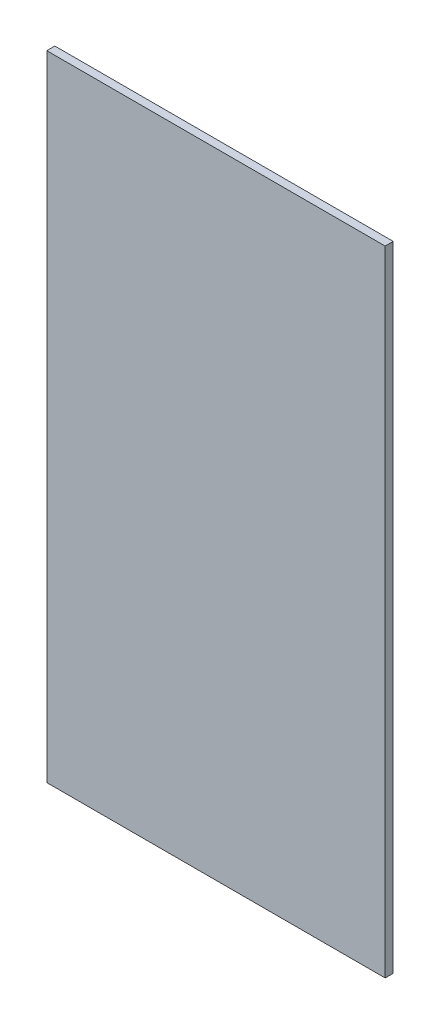
ISO-10303-21;
HEADER;
FILE_DESCRIPTION(('STEP AP214'),'2;1');
FILE_NAME('part.step','',(''),(''),'','','');
FILE_SCHEMA(('AUTOMOTIVE_DESIGN { 1 0 10303 214 1 1 1 1 }'));
ENDSEC;
DATA;
#1=APPLICATION_CONTEXT('core data for automotive mechanical design processes');
#2=APPLICATION_PROTOCOL_DEFINITION('international standard','automotive_design',2000,#1);
#3=PRODUCT_CONTEXT('',#1,'mechanical');
#4=PRODUCT('Part','Part','',(#3));
#5=PRODUCT_RELATED_PRODUCT_CATEGORY('part','',(#4));
#6=PRODUCT_DEFINITION_FORMATION('','',#4);
#7=PRODUCT_DEFINITION_CONTEXT('part definition',#1,'design');
#8=PRODUCT_DEFINITION('design','',#6,#7);
#9=PRODUCT_DEFINITION_SHAPE('','',#8);
#10=(LENGTH_UNIT() NAMED_UNIT(*) SI_UNIT(.MILLI.,.METRE.));
#11=(NAMED_UNIT(*) PLANE_ANGLE_UNIT() SI_UNIT($,.RADIAN.));
#12=(NAMED_UNIT(*) SI_UNIT($,.STERADIAN.) SOLID_ANGLE_UNIT());
#13=UNCERTAINTY_MEASURE_WITH_UNIT(LENGTH_MEASURE(1.E-05),#10,'distance_accuracy_value','');
#14=(GEOMETRIC_REPRESENTATION_CONTEXT(3) GLOBAL_UNCERTAINTY_ASSIGNED_CONTEXT((#13)) GLOBAL_UNIT_ASSIGNED_CONTEXT((#10,
#11,#12)) REPRESENTATION_CONTEXT('',''));
#15=CARTESIAN_POINT('',(0.,0.,0.));
#16=DIRECTION('',(0.,0.,1.));
#17=DIRECTION('',(1.,0.,0.));
#18=AXIS2_PLACEMENT_3D('',#15,#16,#17);
#19=CARTESIAN_POINT('',(61.5,116.5,1.5));
#20=DIRECTION('',(-1.,0.,0.));
#21=DIRECTION('',(0.,0.,1.));
#22=AXIS2_PLACEMENT_3D('',#19,#20,#21);
#23=PLANE('',#22);
#24=DIRECTION('',(0.,1.,0.));
#25=VECTOR('',#24,1.);
#26=CARTESIAN_POINT('',(61.5,116.5,0.));
#27=LINE('',#26,#25);
#28=CARTESIAN_POINT('',(61.5,-1.5,0.));
#29=VERTEX_POINT('',#28);
#30=CARTESIAN_POINT('',(61.5,116.5,0.));
#31=VERTEX_POINT('',#30);
#32=EDGE_CURVE('E95',#29,#31,#27,.T.);
#33=ORIENTED_EDGE('',*,*,#32,.T.);
#34=DIRECTION('',(0.,0.,-1.));
#35=VECTOR('',#34,1.);
#36=CARTESIAN_POINT('',(61.5,116.5,1.5));
#37=LINE('',#36,#35);
#38=CARTESIAN_POINT('',(61.5,116.5,1.5));
#39=VERTEX_POINT('',#38);
#40=EDGE_CURVE('E11',#39,#31,#37,.T.);
#41=ORIENTED_EDGE('',*,*,#40,.F.);
#42=DIRECTION('',(0.,1.,0.));
#43=VECTOR('',#42,1.);
#44=CARTESIAN_POINT('',(61.5,116.5,1.5));
#45=LINE('',#44,#43);
#46=CARTESIAN_POINT('',(61.5,-1.5,1.5));
#47=VERTEX_POINT('',#46);
#48=EDGE_CURVE('E83',#47,#39,#45,.T.);
#49=ORIENTED_EDGE('',*,*,#48,.F.);
#50=DIRECTION('',(0.,0.,-1.));
#51=VECTOR('',#50,1.);
#52=CARTESIAN_POINT('',(61.5,-1.5,1.5));
#53=LINE('',#52,#51);
#54=EDGE_CURVE('E91',#47,#29,#53,.T.);
#55=ORIENTED_EDGE('',*,*,#54,.T.);
#56=EDGE_LOOP('',(#33,#41,#49,#55));
#57=FACE_BOUND('',#56,.T.);
#58=ADVANCED_FACE('F32',(#57),#23,.F.);
#59=CARTESIAN_POINT('',(61.5,116.5,1.5));
#60=DIRECTION('',(0.,-1.,0.));
#61=DIRECTION('',(0.,0.,-1.));
#62=AXIS2_PLACEMENT_3D('',#59,#60,#61);
#63=PLANE('',#62);
#64=DIRECTION('',(-1.,0.,0.));
#65=VECTOR('',#64,1.);
#66=CARTESIAN_POINT('',(61.5,116.5,0.));
#67=LINE('',#66,#65);
#68=CARTESIAN_POINT('',(-1.5,116.5,0.));
#69=VERTEX_POINT('',#68);
#70=EDGE_CURVE('E87',#31,#69,#67,.T.);
#71=ORIENTED_EDGE('',*,*,#70,.T.);
#72=DIRECTION('',(0.,0.,-1.));
#73=VECTOR('',#72,1.);
#74=CARTESIAN_POINT('',(-1.5,116.5,1.5));
#75=LINE('',#74,#73);
#76=CARTESIAN_POINT('',(-1.5,116.5,1.5));
#77=VERTEX_POINT('',#76);
#78=EDGE_CURVE('E40',#77,#69,#75,.T.);
#79=ORIENTED_EDGE('',*,*,#78,.F.);
#80=DIRECTION('',(-1.,0.,0.));
#81=VECTOR('',#80,1.);
#82=CARTESIAN_POINT('',(61.5,116.5,1.5));
#83=LINE('',#82,#81);
#84=EDGE_CURVE('E78',#39,#77,#83,.T.);
#85=ORIENTED_EDGE('',*,*,#84,.F.);
#86=ORIENTED_EDGE('',*,*,#40,.T.);
#87=EDGE_LOOP('',(#71,#79,#85,#86));
#88=FACE_BOUND('',#87,.T.);
#89=ADVANCED_FACE('F86',(#88),#63,.F.);
#90=CARTESIAN_POINT('',(-1.5,116.5,1.5));
#91=DIRECTION('',(1.,0.,0.));
#92=DIRECTION('',(0.,0.,-1.));
#93=AXIS2_PLACEMENT_3D('',#90,#91,#92);
#94=PLANE('',#93);
#95=DIRECTION('',(0.,-1.,0.));
#96=VECTOR('',#95,1.);
#97=CARTESIAN_POINT('',(-1.5,116.5,0.));
#98=LINE('',#97,#96);
#99=CARTESIAN_POINT('',(-1.5,-1.5,0.));
#100=VERTEX_POINT('',#99);
#101=EDGE_CURVE('E65',#69,#100,#98,.T.);
#102=ORIENTED_EDGE('',*,*,#101,.T.);
#103=DIRECTION('',(0.,0.,-1.));
#104=VECTOR('',#103,1.);
#105=CARTESIAN_POINT('',(-1.5,-1.5,1.5));
#106=LINE('',#105,#104);
#107=CARTESIAN_POINT('',(-1.5,-1.5,1.5));
#108=VERTEX_POINT('',#107);
#109=EDGE_CURVE('E88',#108,#100,#106,.T.);
#110=ORIENTED_EDGE('',*,*,#109,.F.);
#111=DIRECTION('',(0.,-1.,0.));
#112=VECTOR('',#111,1.);
#113=CARTESIAN_POINT('',(-1.5,116.5,1.5));
#114=LINE('',#113,#112);
#115=EDGE_CURVE('E81',#77,#108,#114,.T.);
#116=ORIENTED_EDGE('',*,*,#115,.F.);
#117=ORIENTED_EDGE('',*,*,#78,.T.);
#118=EDGE_LOOP('',(#102,#110,#116,#117));
#119=FACE_BOUND('',#118,.T.);
#120=ADVANCED_FACE('F89',(#119),#94,.F.);
#121=CARTESIAN_POINT('',(61.5,-1.5,1.5));
#122=DIRECTION('',(0.,1.,0.));
#123=DIRECTION('',(0.,0.,1.));
#124=AXIS2_PLACEMENT_3D('',#121,#122,#123);
#125=PLANE('',#124);
#126=DIRECTION('',(1.,0.,0.));
#127=VECTOR('',#126,1.);
#128=CARTESIAN_POINT('',(61.5,-1.5,0.));
#129=LINE('',#128,#127);
#130=EDGE_CURVE('E71',#100,#29,#129,.T.);
#131=ORIENTED_EDGE('',*,*,#130,.T.);
#132=ORIENTED_EDGE('',*,*,#54,.F.);
#133=DIRECTION('',(1.,0.,0.));
#134=VECTOR('',#133,1.);
#135=CARTESIAN_POINT('',(61.5,-1.5,1.5));
#136=LINE('',#135,#134);
#137=EDGE_CURVE('E48',#108,#47,#136,.T.);
#138=ORIENTED_EDGE('',*,*,#137,.F.);
#139=ORIENTED_EDGE('',*,*,#109,.T.);
#140=EDGE_LOOP('',(#131,#132,#138,#139));
#141=FACE_BOUND('',#140,.T.);
#142=ADVANCED_FACE('F102',(#141),#125,.F.);
#143=CARTESIAN_POINT('',(0.,0.,1.5));
#144=DIRECTION('',(0.,0.,-1.));
#145=DIRECTION('',(-1.,0.,0.));
#146=AXIS2_PLACEMENT_3D('',#143,#144,#145);
#147=PLANE('',#146);
#148=ORIENTED_EDGE('',*,*,#48,.T.);
#149=ORIENTED_EDGE('',*,*,#84,.T.);
#150=ORIENTED_EDGE('',*,*,#115,.T.);
#151=ORIENTED_EDGE('',*,*,#137,.T.);
#152=EDGE_LOOP('',(#148,#149,#150,#151));
#153=FACE_BOUND('',#152,.T.);
#154=ADVANCED_FACE('F79',(#153),#147,.F.);
#155=CARTESIAN_POINT('',(0.,0.,0.));
#156=DIRECTION('',(0.,0.,-1.));
#157=DIRECTION('',(-1.,0.,0.));
#158=AXIS2_PLACEMENT_3D('',#155,#156,#157);
#159=PLANE('',#158);
#160=ORIENTED_EDGE('',*,*,#32,.F.);
#161=ORIENTED_EDGE('',*,*,#130,.F.);
#162=ORIENTED_EDGE('',*,*,#101,.F.);
#163=ORIENTED_EDGE('',*,*,#70,.F.);
#164=EDGE_LOOP('',(#160,#161,#162,#163));
#165=FACE_BOUND('',#164,.T.);
#166=ADVANCED_FACE('F105',(#165),#159,.T.);
#167=CLOSED_SHELL('',(#58,#89,#120,#142,#154,#166));
#168=MANIFOLD_SOLID_BREP('B2',#167);
#169=ADVANCED_BREP_SHAPE_REPRESENTATION('',(#18,#168),#14);
#170=SHAPE_DEFINITION_REPRESENTATION(#9,#169);
ENDSEC;
END-ISO-10303-21;
